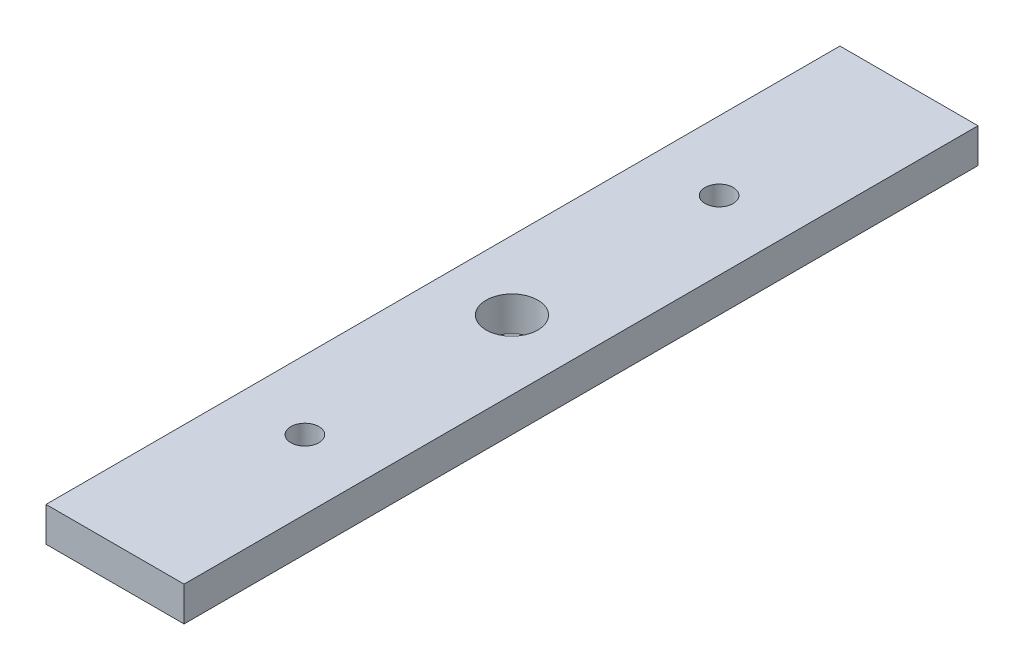
ISO-10303-21;
HEADER;
FILE_DESCRIPTION(('STEP AP214'),'2;1');
FILE_NAME('part.step','',(''),(''),'','','');
FILE_SCHEMA(('AUTOMOTIVE_DESIGN { 1 0 10303 214 1 1 1 1 }'));
ENDSEC;
DATA;
#1=APPLICATION_CONTEXT('core data for automotive mechanical design processes');
#2=APPLICATION_PROTOCOL_DEFINITION('international standard','automotive_design',2000,#1);
#3=PRODUCT_CONTEXT('',#1,'mechanical');
#4=PRODUCT('Part','Part','',(#3));
#5=PRODUCT_RELATED_PRODUCT_CATEGORY('part','',(#4));
#6=PRODUCT_DEFINITION_FORMATION('','',#4);
#7=PRODUCT_DEFINITION_CONTEXT('part definition',#1,'design');
#8=PRODUCT_DEFINITION('design','',#6,#7);
#9=PRODUCT_DEFINITION_SHAPE('','',#8);
#10=(LENGTH_UNIT() NAMED_UNIT(*) SI_UNIT(.MILLI.,.METRE.));
#11=(NAMED_UNIT(*) PLANE_ANGLE_UNIT() SI_UNIT($,.RADIAN.));
#12=(NAMED_UNIT(*) SI_UNIT($,.STERADIAN.) SOLID_ANGLE_UNIT());
#13=UNCERTAINTY_MEASURE_WITH_UNIT(LENGTH_MEASURE(1.E-05),#10,'distance_accuracy_value','');
#14=(GEOMETRIC_REPRESENTATION_CONTEXT(3) GLOBAL_UNCERTAINTY_ASSIGNED_CONTEXT((#13)) GLOBAL_UNIT_ASSIGNED_CONTEXT((#10,
#11,#12)) REPRESENTATION_CONTEXT('',''));
#15=CARTESIAN_POINT('',(0.,0.,0.));
#16=DIRECTION('',(0.,0.,1.));
#17=DIRECTION('',(1.,0.,0.));
#18=AXIS2_PLACEMENT_3D('',#15,#16,#17);
#19=CARTESIAN_POINT('',(0.,12.7,0.));
#20=DIRECTION('',(1.,0.,0.));
#21=DIRECTION('',(0.,0.,-1.));
#22=AXIS2_PLACEMENT_3D('',#19,#20,#21);
#23=PLANE('',#22);
#24=DIRECTION('',(0.,0.,1.));
#25=VECTOR('',#24,1.);
#26=CARTESIAN_POINT('',(0.,0.,0.));
#27=LINE('',#26,#25);
#28=CARTESIAN_POINT('',(0.,0.,-292.1));
#29=VERTEX_POINT('',#28);
#30=CARTESIAN_POINT('',(0.,0.,0.));
#31=VERTEX_POINT('',#30);
#32=EDGE_CURVE('E103',#29,#31,#27,.T.);
#33=ORIENTED_EDGE('',*,*,#32,.T.);
#34=DIRECTION('',(0.,-1.,0.));
#35=VECTOR('',#34,1.);
#36=CARTESIAN_POINT('',(0.,12.7,0.));
#37=LINE('',#36,#35);
#38=CARTESIAN_POINT('',(0.,12.7,0.));
#39=VERTEX_POINT('',#38);
#40=EDGE_CURVE('E11',#39,#31,#37,.T.);
#41=ORIENTED_EDGE('',*,*,#40,.F.);
#42=DIRECTION('',(0.,0.,1.));
#43=VECTOR('',#42,1.);
#44=CARTESIAN_POINT('',(0.,12.7,0.));
#45=LINE('',#44,#43);
#46=CARTESIAN_POINT('',(0.,12.7,-292.1));
#47=VERTEX_POINT('',#46);
#48=EDGE_CURVE('E91',#47,#39,#45,.T.);
#49=ORIENTED_EDGE('',*,*,#48,.F.);
#50=DIRECTION('',(0.,-1.,0.));
#51=VECTOR('',#50,1.);
#52=CARTESIAN_POINT('',(0.,12.7,-292.1));
#53=LINE('',#52,#51);
#54=EDGE_CURVE('E99',#47,#29,#53,.T.);
#55=ORIENTED_EDGE('',*,*,#54,.T.);
#56=EDGE_LOOP('',(#33,#41,#49,#55));
#57=FACE_BOUND('',#56,.T.);
#58=ADVANCED_FACE('F40',(#57),#23,.F.);
#59=CARTESIAN_POINT('',(0.,12.7,0.));
#60=DIRECTION('',(0.,0.,-1.));
#61=DIRECTION('',(-1.,0.,0.));
#62=AXIS2_PLACEMENT_3D('',#59,#60,#61);
#63=PLANE('',#62);
#64=DIRECTION('',(1.,0.,0.));
#65=VECTOR('',#64,1.);
#66=CARTESIAN_POINT('',(0.,0.,0.));
#67=LINE('',#66,#65);
#68=CARTESIAN_POINT('',(50.8,0.,0.));
#69=VERTEX_POINT('',#68);
#70=EDGE_CURVE('E95',#31,#69,#67,.T.);
#71=ORIENTED_EDGE('',*,*,#70,.T.);
#72=DIRECTION('',(0.,-1.,0.));
#73=VECTOR('',#72,1.);
#74=CARTESIAN_POINT('',(50.8,12.7,0.));
#75=LINE('',#74,#73);
#76=CARTESIAN_POINT('',(50.8,12.7,0.));
#77=VERTEX_POINT('',#76);
#78=EDGE_CURVE('E48',#77,#69,#75,.T.);
#79=ORIENTED_EDGE('',*,*,#78,.F.);
#80=DIRECTION('',(1.,0.,0.));
#81=VECTOR('',#80,1.);
#82=CARTESIAN_POINT('',(0.,12.7,0.));
#83=LINE('',#82,#81);
#84=EDGE_CURVE('E86',#39,#77,#83,.T.);
#85=ORIENTED_EDGE('',*,*,#84,.F.);
#86=ORIENTED_EDGE('',*,*,#40,.T.);
#87=EDGE_LOOP('',(#71,#79,#85,#86));
#88=FACE_BOUND('',#87,.T.);
#89=ADVANCED_FACE('F94',(#88),#63,.F.);
#90=CARTESIAN_POINT('',(50.8,12.7,0.));
#91=DIRECTION('',(-1.,0.,0.));
#92=DIRECTION('',(0.,0.,1.));
#93=AXIS2_PLACEMENT_3D('',#90,#91,#92);
#94=PLANE('',#93);
#95=DIRECTION('',(0.,0.,-1.));
#96=VECTOR('',#95,1.);
#97=CARTESIAN_POINT('',(50.8,0.,0.));
#98=LINE('',#97,#96);
#99=CARTESIAN_POINT('',(50.8,0.,-292.1));
#100=VERTEX_POINT('',#99);
#101=EDGE_CURVE('E73',#69,#100,#98,.T.);
#102=ORIENTED_EDGE('',*,*,#101,.T.);
#103=DIRECTION('',(0.,-1.,0.));
#104=VECTOR('',#103,1.);
#105=CARTESIAN_POINT('',(50.8,12.7,-292.1));
#106=LINE('',#105,#104);
#107=CARTESIAN_POINT('',(50.8,12.7,-292.1));
#108=VERTEX_POINT('',#107);
#109=EDGE_CURVE('E96',#108,#100,#106,.T.);
#110=ORIENTED_EDGE('',*,*,#109,.F.);
#111=DIRECTION('',(0.,0.,-1.));
#112=VECTOR('',#111,1.);
#113=CARTESIAN_POINT('',(50.8,12.7,0.));
#114=LINE('',#113,#112);
#115=EDGE_CURVE('E89',#77,#108,#114,.T.);
#116=ORIENTED_EDGE('',*,*,#115,.F.);
#117=ORIENTED_EDGE('',*,*,#78,.T.);
#118=EDGE_LOOP('',(#102,#110,#116,#117));
#119=FACE_BOUND('',#118,.T.);
#120=ADVANCED_FACE('F97',(#119),#94,.F.);
#121=CARTESIAN_POINT('',(0.,12.7,-292.1));
#122=DIRECTION('',(0.,0.,1.));
#123=DIRECTION('',(1.,0.,0.));
#124=AXIS2_PLACEMENT_3D('',#121,#122,#123);
#125=PLANE('',#124);
#126=DIRECTION('',(-1.,0.,0.));
#127=VECTOR('',#126,1.);
#128=CARTESIAN_POINT('',(0.,0.,-292.1));
#129=LINE('',#128,#127);
#130=EDGE_CURVE('E79',#100,#29,#129,.T.);
#131=ORIENTED_EDGE('',*,*,#130,.T.);
#132=ORIENTED_EDGE('',*,*,#54,.F.);
#133=DIRECTION('',(-1.,0.,0.));
#134=VECTOR('',#133,1.);
#135=CARTESIAN_POINT('',(0.,12.7,-292.1));
#136=LINE('',#135,#134);
#137=EDGE_CURVE('E56',#108,#47,#136,.T.);
#138=ORIENTED_EDGE('',*,*,#137,.F.);
#139=ORIENTED_EDGE('',*,*,#109,.T.);
#140=EDGE_LOOP('',(#131,#132,#138,#139));
#141=FACE_BOUND('',#140,.T.);
#142=ADVANCED_FACE('F111',(#141),#125,.F.);
#143=CARTESIAN_POINT('',(0.,12.7,-292.1));
#144=DIRECTION('',(0.,-1.,0.));
#145=DIRECTION('',(0.,0.,-1.));
#146=AXIS2_PLACEMENT_3D('',#143,#144,#145);
#147=PLANE('',#146);
#148=CARTESIAN_POINT('',(25.4000000000003,12.7,-146.05));
#149=DIRECTION('',(0.,-1.,0.));
#150=DIRECTION('',(0.,0.,-1.));
#151=AXIS2_PLACEMENT_3D('',#148,#149,#150);
#152=CIRCLE('',#151,9.525);
#153=CARTESIAN_POINT('',(25.4000000000003,12.7,-155.575));
#154=VERTEX_POINT('',#153);
#155=EDGE_CURVE('E128',#154,#154,#152,.T.);
#156=ORIENTED_EDGE('',*,*,#155,.T.);
#157=EDGE_LOOP('',(#156));
#158=FACE_BOUND('',#157,.T.);
#159=CARTESIAN_POINT('',(25.4,12.7,-69.85));
#160=DIRECTION('',(0.,1.,0.));
#161=DIRECTION('',(0.,0.,1.));
#162=AXIS2_PLACEMENT_3D('',#159,#160,#161);
#163=CIRCLE('',#162,5.15873999999999);
#164=CARTESIAN_POINT('',(25.4,12.7,-64.69126));
#165=VERTEX_POINT('',#164);
#166=EDGE_CURVE('E125',#165,#165,#163,.T.);
#167=ORIENTED_EDGE('',*,*,#166,.F.);
#168=EDGE_LOOP('',(#167));
#169=FACE_BOUND('',#168,.T.);
#170=CARTESIAN_POINT('',(25.4,12.7,-222.25));
#171=DIRECTION('',(0.,1.,0.));
#172=DIRECTION('',(0.,0.,1.));
#173=AXIS2_PLACEMENT_3D('',#170,#171,#172);
#174=CIRCLE('',#173,5.15873999999999);
#175=CARTESIAN_POINT('',(25.4,12.7,-217.09126));
#176=VERTEX_POINT('',#175);
#177=EDGE_CURVE('E119',#176,#176,#174,.T.);
#178=ORIENTED_EDGE('',*,*,#177,.F.);
#179=EDGE_LOOP('',(#178));
#180=FACE_BOUND('',#179,.T.);
#181=ORIENTED_EDGE('',*,*,#48,.T.);
#182=ORIENTED_EDGE('',*,*,#84,.T.);
#183=ORIENTED_EDGE('',*,*,#115,.T.);
#184=ORIENTED_EDGE('',*,*,#137,.T.);
#185=EDGE_LOOP('',(#181,#182,#183,#184));
#186=FACE_BOUND('',#185,.T.);
#187=ADVANCED_FACE('F87',(#158,#169,#180,#186),#147,.F.);
#188=CARTESIAN_POINT('',(0.,0.,-292.1));
#189=DIRECTION('',(0.,-1.,0.));
#190=DIRECTION('',(0.,0.,-1.));
#191=AXIS2_PLACEMENT_3D('',#188,#189,#190);
#192=PLANE('',#191);
#193=CARTESIAN_POINT('',(25.4000000000003,0.,-146.05));
#194=DIRECTION('',(0.,-1.,0.));
#195=DIRECTION('',(0.,0.,-1.));
#196=AXIS2_PLACEMENT_3D('',#193,#194,#195);
#197=CIRCLE('',#196,9.525);
#198=CARTESIAN_POINT('',(25.4000000000003,0.,-155.575));
#199=VERTEX_POINT('',#198);
#200=EDGE_CURVE('E129',#199,#199,#197,.T.);
#201=ORIENTED_EDGE('',*,*,#200,.F.);
#202=EDGE_LOOP('',(#201));
#203=FACE_BOUND('',#202,.T.);
#204=CARTESIAN_POINT('',(25.4,0.,-69.85));
#205=DIRECTION('',(0.,1.,0.));
#206=DIRECTION('',(0.,0.,1.));
#207=AXIS2_PLACEMENT_3D('',#204,#205,#206);
#208=CIRCLE('',#207,5.15873999999999);
#209=CARTESIAN_POINT('',(25.4,0.,-64.69126));
#210=VERTEX_POINT('',#209);
#211=EDGE_CURVE('E122',#210,#210,#208,.T.);
#212=ORIENTED_EDGE('',*,*,#211,.T.);
#213=EDGE_LOOP('',(#212));
#214=FACE_BOUND('',#213,.T.);
#215=CARTESIAN_POINT('',(25.4,0.,-222.25));
#216=DIRECTION('',(0.,1.,0.));
#217=DIRECTION('',(0.,0.,1.));
#218=AXIS2_PLACEMENT_3D('',#215,#216,#217);
#219=CIRCLE('',#218,5.15873999999999);
#220=CARTESIAN_POINT('',(25.4,0.,-217.09126));
#221=VERTEX_POINT('',#220);
#222=EDGE_CURVE('E106',#221,#221,#219,.T.);
#223=ORIENTED_EDGE('',*,*,#222,.T.);
#224=EDGE_LOOP('',(#223));
#225=FACE_BOUND('',#224,.T.);
#226=ORIENTED_EDGE('',*,*,#32,.F.);
#227=ORIENTED_EDGE('',*,*,#130,.F.);
#228=ORIENTED_EDGE('',*,*,#101,.F.);
#229=ORIENTED_EDGE('',*,*,#70,.F.);
#230=EDGE_LOOP('',(#226,#227,#228,#229));
#231=FACE_BOUND('',#230,.T.);
#232=ADVANCED_FACE('F114',(#203,#214,#225,#231),#192,.T.);
#233=CARTESIAN_POINT('',(25.4,12.7,-222.25));
#234=DIRECTION('',(0.,1.,0.));
#235=DIRECTION('',(0.,0.,1.));
#236=AXIS2_PLACEMENT_3D('',#233,#234,#235);
#237=CYLINDRICAL_SURFACE('',#236,5.15873999999999);
#238=ORIENTED_EDGE('',*,*,#222,.F.);
#239=EDGE_LOOP('',(#238));
#240=FACE_BOUND('',#239,.T.);
#241=ORIENTED_EDGE('',*,*,#177,.T.);
#242=EDGE_LOOP('',(#241));
#243=FACE_BOUND('',#242,.T.);
#244=ADVANCED_FACE('F146',(#240,#243),#237,.F.);
#245=CARTESIAN_POINT('',(25.4,12.7,-69.85));
#246=DIRECTION('',(0.,1.,0.));
#247=DIRECTION('',(0.,0.,1.));
#248=AXIS2_PLACEMENT_3D('',#245,#246,#247);
#249=CYLINDRICAL_SURFACE('',#248,5.15873999999999);
#250=ORIENTED_EDGE('',*,*,#211,.F.);
#251=EDGE_LOOP('',(#250));
#252=FACE_BOUND('',#251,.T.);
#253=ORIENTED_EDGE('',*,*,#166,.T.);
#254=EDGE_LOOP('',(#253));
#255=FACE_BOUND('',#254,.T.);
#256=ADVANCED_FACE('F140',(#252,#255),#249,.F.);
#257=CARTESIAN_POINT('',(25.4000000000003,12.7,-146.05));
#258=DIRECTION('',(0.,-1.,0.));
#259=DIRECTION('',(0.,0.,-1.));
#260=AXIS2_PLACEMENT_3D('',#257,#258,#259);
#261=CYLINDRICAL_SURFACE('',#260,9.525);
#262=CARTESIAN_POINT('',(25.4000000000003,12.7,-155.575));
#263=CARTESIAN_POINT('',(25.4000000000003,12.5677083333333,-155.575));
#264=CARTESIAN_POINT('',(25.4000000000003,12.4354166666667,-155.575));
#265=CARTESIAN_POINT('',(25.4000000000003,12.1708333333333,-155.575));
#266=CARTESIAN_POINT('',(25.4000000000003,12.0385416666667,-155.575));
#267=CARTESIAN_POINT('',(25.4000000000003,11.7739583333333,-155.575));
#268=CARTESIAN_POINT('',(25.4000000000003,11.6416666666667,-155.575));
#269=CARTESIAN_POINT('',(25.4000000000003,11.3770833333333,-155.575));
#270=CARTESIAN_POINT('',(25.4000000000003,11.2447916666667,-155.575));
#271=CARTESIAN_POINT('',(25.4000000000003,10.9802083333333,-155.575));
#272=CARTESIAN_POINT('',(25.4000000000003,10.8479166666667,-155.575));
#273=CARTESIAN_POINT('',(25.4000000000003,10.5833333333333,-155.575));
#274=CARTESIAN_POINT('',(25.4000000000003,10.4510416666667,-155.575));
#275=CARTESIAN_POINT('',(25.4000000000003,10.1864583333333,-155.575));
#276=CARTESIAN_POINT('',(25.4000000000003,10.0541666666667,-155.575));
#277=CARTESIAN_POINT('',(25.4000000000003,9.78958333333334,-155.575));
#278=CARTESIAN_POINT('',(25.4000000000003,9.65729166666667,-155.575));
#279=CARTESIAN_POINT('',(25.4000000000003,9.39270833333333,-155.575));
#280=CARTESIAN_POINT('',(25.4000000000003,9.26041666666667,-155.575));
#281=CARTESIAN_POINT('',(25.4000000000003,8.99583333333334,-155.575));
#282=CARTESIAN_POINT('',(25.4000000000003,8.86354166666667,-155.575));
#283=CARTESIAN_POINT('',(25.4000000000003,8.59895833333334,-155.575));
#284=CARTESIAN_POINT('',(25.4000000000003,8.46666666666667,-155.575));
#285=CARTESIAN_POINT('',(25.4000000000003,8.20208333333333,-155.575));
#286=CARTESIAN_POINT('',(25.4000000000003,8.06979166666667,-155.575));
#287=CARTESIAN_POINT('',(25.4000000000003,7.80520833333333,-155.575));
#288=CARTESIAN_POINT('',(25.4000000000003,7.67291666666667,-155.575));
#289=CARTESIAN_POINT('',(25.4000000000003,7.40833333333333,-155.575));
#290=CARTESIAN_POINT('',(25.4000000000003,7.27604166666667,-155.575));
#291=CARTESIAN_POINT('',(25.4000000000003,7.01145833333333,-155.575));
#292=CARTESIAN_POINT('',(25.4000000000003,6.87916666666667,-155.575));
#293=CARTESIAN_POINT('',(25.4000000000003,6.61458333333333,-155.575));
#294=CARTESIAN_POINT('',(25.4000000000003,6.48229166666667,-155.575));
#295=CARTESIAN_POINT('',(25.4000000000003,6.21770833333333,-155.575));
#296=CARTESIAN_POINT('',(25.4000000000003,6.08541666666667,-155.575));
#297=CARTESIAN_POINT('',(25.4000000000003,5.82083333333333,-155.575));
#298=CARTESIAN_POINT('',(25.4000000000003,5.68854166666667,-155.575));
#299=CARTESIAN_POINT('',(25.4000000000003,5.42395833333333,-155.575));
#300=CARTESIAN_POINT('',(25.4000000000003,5.29166666666667,-155.575));
#301=CARTESIAN_POINT('',(25.4000000000003,5.02708333333333,-155.575));
#302=CARTESIAN_POINT('',(25.4000000000003,4.89479166666667,-155.575));
#303=CARTESIAN_POINT('',(25.4000000000003,4.63020833333333,-155.575));
#304=CARTESIAN_POINT('',(25.4000000000003,4.49791666666667,-155.575));
#305=CARTESIAN_POINT('',(25.4000000000003,4.23333333333333,-155.575));
#306=CARTESIAN_POINT('',(25.4000000000003,4.10104166666667,-155.575));
#307=CARTESIAN_POINT('',(25.4000000000003,3.83645833333334,-155.575));
#308=CARTESIAN_POINT('',(25.4000000000003,3.70416666666667,-155.575));
#309=CARTESIAN_POINT('',(25.4000000000003,3.43958333333333,-155.575));
#310=CARTESIAN_POINT('',(25.4000000000003,3.30729166666667,-155.575));
#311=CARTESIAN_POINT('',(25.4000000000003,3.04270833333333,-155.575));
#312=CARTESIAN_POINT('',(25.4000000000003,2.91041666666667,-155.575));
#313=CARTESIAN_POINT('',(25.4000000000003,2.64583333333333,-155.575));
#314=CARTESIAN_POINT('',(25.4000000000003,2.51354166666667,-155.575));
#315=CARTESIAN_POINT('',(25.4000000000003,2.24895833333333,-155.575));
#316=CARTESIAN_POINT('',(25.4000000000003,2.11666666666667,-155.575));
#317=CARTESIAN_POINT('',(25.4000000000003,1.85208333333333,-155.575));
#318=CARTESIAN_POINT('',(25.4000000000003,1.71979166666667,-155.575));
#319=CARTESIAN_POINT('',(25.4000000000003,1.45520833333333,-155.575));
#320=CARTESIAN_POINT('',(25.4000000000003,1.32291666666667,-155.575));
#321=CARTESIAN_POINT('',(25.4000000000003,1.05833333333333,-155.575));
#322=CARTESIAN_POINT('',(25.4000000000003,0.926041666666668,-155.575));
#323=CARTESIAN_POINT('',(25.4000000000003,0.661458333333334,-155.575));
#324=CARTESIAN_POINT('',(25.4000000000003,0.529166666666667,-155.575));
#325=CARTESIAN_POINT('',(25.4000000000003,0.264583333333333,-155.575));
#326=CARTESIAN_POINT('',(25.4000000000003,0.132291666666667,-155.575));
#327=CARTESIAN_POINT('',(25.4000000000003,0.,-155.575));
#328=B_SPLINE_CURVE_WITH_KNOTS('',3,(#262,#263,#264,#265,#266,#267,#268,#269,#270,#271,#272,
#273,#274,#275,#276,#277,#278,#279,#280,#281,#282,#283,#284,#285,#286,#287,#288,#289,#290,#291,
#292,#293,#294,#295,#296,#297,#298,#299,#300,#301,#302,#303,#304,#305,#306,#307,#308,#309,#310,
#311,#312,#313,#314,#315,#316,#317,#318,#319,#320,#321,#322,#323,#324,#325,#326,#327),
.UNSPECIFIED.,.F.,.F.,(4,2,2,2,2,2,2,2,2,2,2,2,2,2,2,2,2,2,2,2,2,2,2,2,2,2,2,2,2,2,2,2,4),(0.,
0.396875000000001,0.793750000000001,1.190625,1.5875,1.984375,2.38125,2.778125,3.175,3.571875,
3.96875,4.365625,4.7625,5.159375,5.55625,5.953125,6.35,6.746875,7.14375,7.540625,7.9375,
8.334375,8.73125,9.128125,9.525,9.921875,10.31875,10.715625,11.1125,11.509375,11.90625,
12.303125,12.7),.UNSPECIFIED.);
#329=EDGE_CURVE('BSEAM137',#154,#199,#328,.T.);
#330=ORIENTED_EDGE('',*,*,#155,.F.);
#331=ORIENTED_EDGE('',*,*,#200,.T.);
#332=ORIENTED_EDGE('',*,*,#329,.T.);
#333=ORIENTED_EDGE('',*,*,#329,.F.);
#334=EDGE_LOOP('',(#330,#332,#331,#333));
#335=FACE_BOUND('',#334,.T.);
#336=ADVANCED_FACE('F137',(#335),#261,.F.);
#337=CLOSED_SHELL('',(#58,#89,#120,#142,#187,#232,#244,#256,#336));
#338=MANIFOLD_SOLID_BREP('B2',#337);
#339=ADVANCED_BREP_SHAPE_REPRESENTATION('',(#18,#338),#14);
#340=SHAPE_DEFINITION_REPRESENTATION(#9,#339);
ENDSEC;
END-ISO-10303-21;
